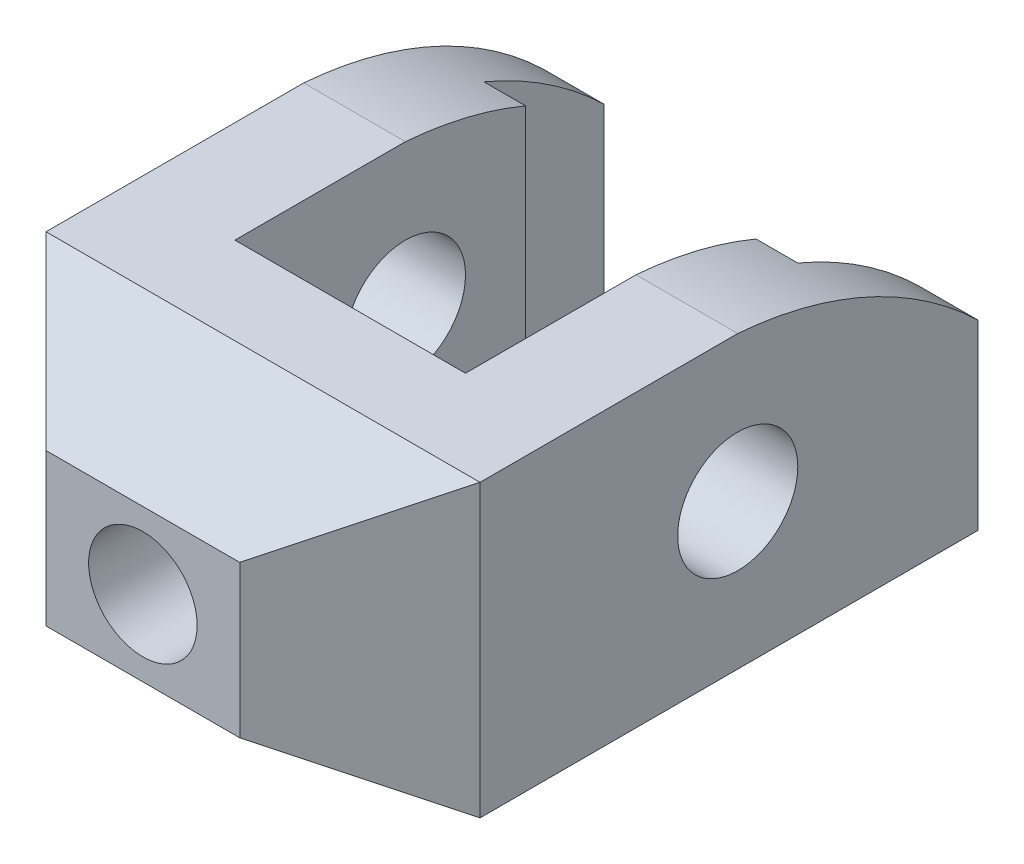
ISO-10303-21;
HEADER;
FILE_DESCRIPTION(('STEP AP214'),'2;1');
FILE_NAME('part.step','',(''),(''),'','','');
FILE_SCHEMA(('AUTOMOTIVE_DESIGN { 1 0 10303 214 1 1 1 1 }'));
ENDSEC;
DATA;
#1=APPLICATION_CONTEXT('core data for automotive mechanical design processes');
#2=APPLICATION_PROTOCOL_DEFINITION('international standard','automotive_design',2000,#1);
#3=PRODUCT_CONTEXT('',#1,'mechanical');
#4=PRODUCT('Part','Part','',(#3));
#5=PRODUCT_RELATED_PRODUCT_CATEGORY('part','',(#4));
#6=PRODUCT_DEFINITION_FORMATION('','',#4);
#7=PRODUCT_DEFINITION_CONTEXT('part definition',#1,'design');
#8=PRODUCT_DEFINITION('design','',#6,#7);
#9=PRODUCT_DEFINITION_SHAPE('','',#8);
#10=(LENGTH_UNIT() NAMED_UNIT(*) SI_UNIT(.MILLI.,.METRE.));
#11=(NAMED_UNIT(*) PLANE_ANGLE_UNIT() SI_UNIT($,.RADIAN.));
#12=(NAMED_UNIT(*) SI_UNIT($,.STERADIAN.) SOLID_ANGLE_UNIT());
#13=UNCERTAINTY_MEASURE_WITH_UNIT(LENGTH_MEASURE(1.E-05),#10,'distance_accuracy_value','');
#14=(GEOMETRIC_REPRESENTATION_CONTEXT(3) GLOBAL_UNCERTAINTY_ASSIGNED_CONTEXT((#13)) GLOBAL_UNIT_ASSIGNED_CONTEXT((#10,
#11,#12)) REPRESENTATION_CONTEXT('',''));
#15=CARTESIAN_POINT('',(0.,0.,0.));
#16=DIRECTION('',(0.,0.,1.));
#17=DIRECTION('',(1.,0.,0.));
#18=AXIS2_PLACEMENT_3D('',#15,#16,#17);
#19=CARTESIAN_POINT('',(0.,150.,0.));
#20=DIRECTION('',(0.,1.,0.));
#21=DIRECTION('',(0.,0.,1.));
#22=AXIS2_PLACEMENT_3D('',#19,#20,#21);
#23=PLANE('',#22);
#24=DIRECTION('',(0.,0.,-1.));
#25=VECTOR('',#24,1.);
#26=CARTESIAN_POINT('',(112.,150.,45.));
#27=LINE('',#26,#25);
#28=CARTESIAN_POINT('',(112.,150.,45.));
#29=VERTEX_POINT('',#28);
#30=CARTESIAN_POINT('',(112.,150.,-88.0000000000001));
#31=VERTEX_POINT('',#30);
#32=EDGE_CURVE('E178',#29,#31,#27,.T.);
#33=ORIENTED_EDGE('',*,*,#32,.T.);
#34=DIRECTION('',(-1.,0.,0.));
#35=VECTOR('',#34,1.);
#36=CARTESIAN_POINT('',(112.,150.,-88.0000000000001));
#37=LINE('',#36,#35);
#38=CARTESIAN_POINT('',(59.4999999999999,150.,-88.0000000000001));
#39=VERTEX_POINT('',#38);
#40=EDGE_CURVE('E171',#31,#39,#37,.T.);
#41=ORIENTED_EDGE('',*,*,#40,.T.);
#42=DIRECTION('',(0.,0.,1.));
#43=VECTOR('',#42,1.);
#44=CARTESIAN_POINT('',(59.5,150.,-150.));
#45=LINE('',#44,#43);
#46=CARTESIAN_POINT('',(59.5,150.,0.));
#47=VERTEX_POINT('',#46);
#48=EDGE_CURVE('E183',#39,#47,#45,.T.);
#49=ORIENTED_EDGE('',*,*,#48,.T.);
#50=DIRECTION('',(-1.,0.,0.));
#51=VECTOR('',#50,1.);
#52=CARTESIAN_POINT('',(59.5,150.,0.));
#53=LINE('',#52,#51);
#54=CARTESIAN_POINT('',(-59.5,150.,0.));
#55=VERTEX_POINT('',#54);
#56=EDGE_CURVE('E194',#47,#55,#53,.T.);
#57=ORIENTED_EDGE('',*,*,#56,.T.);
#58=DIRECTION('',(0.,0.,-1.));
#59=VECTOR('',#58,1.);
#60=CARTESIAN_POINT('',(-59.5,150.,0.));
#61=LINE('',#60,#59);
#62=CARTESIAN_POINT('',(-59.4999999999999,150.,-88.0000000000001));
#63=VERTEX_POINT('',#62);
#64=EDGE_CURVE('E169',#55,#63,#61,.T.);
#65=ORIENTED_EDGE('',*,*,#64,.T.);
#66=CARTESIAN_POINT('',(-112.,150.,-88.0000000000001));
#67=VERTEX_POINT('',#66);
#68=EDGE_CURVE('E153',#63,#67,#37,.T.);
#69=ORIENTED_EDGE('',*,*,#68,.T.);
#70=DIRECTION('',(0.,0.,1.));
#71=VECTOR('',#70,1.);
#72=CARTESIAN_POINT('',(-112.,150.,-212.));
#73=LINE('',#72,#71);
#74=CARTESIAN_POINT('',(-112.,150.,45.));
#75=VERTEX_POINT('',#74);
#76=EDGE_CURVE('E166',#67,#75,#73,.T.);
#77=ORIENTED_EDGE('',*,*,#76,.T.);
#78=DIRECTION('',(-1.,0.,0.));
#79=VECTOR('',#78,1.);
#80=CARTESIAN_POINT('',(112.,150.,45.));
#81=LINE('',#80,#79);
#82=EDGE_CURVE('E298',#29,#75,#81,.T.);
#83=ORIENTED_EDGE('',*,*,#82,.F.);
#84=EDGE_LOOP('',(#33,#41,#49,#57,#65,#69,#77,#83));
#85=FACE_BOUND('',#84,.T.);
#86=ADVANCED_FACE('F38',(#85),#23,.T.);
#87=CARTESIAN_POINT('',(-112.,150.,-212.));
#88=DIRECTION('',(1.,0.,0.));
#89=DIRECTION('',(0.,0.,-1.));
#90=AXIS2_PLACEMENT_3D('',#87,#88,#89);
#91=PLANE('',#90);
#92=CARTESIAN_POINT('',(-112.,75.,-88.));
#93=DIRECTION('',(1.,0.,0.));
#94=DIRECTION('',(0.,0.,-1.));
#95=AXIS2_PLACEMENT_3D('',#92,#93,#94);
#96=CIRCLE('',#95,31.);
#97=CARTESIAN_POINT('',(-112.,75.,-119.));
#98=VERTEX_POINT('',#97);
#99=EDGE_CURVE('E362',#98,#98,#96,.T.);
#100=ORIENTED_EDGE('',*,*,#99,.T.);
#101=EDGE_LOOP('',(#100));
#102=FACE_BOUND('',#101,.T.);
#103=CARTESIAN_POINT('',(-112.,-49.4055273230374,-72.5910521766928));
#104=DIRECTION('',(-1.,0.,0.));
#105=DIRECTION('',(0.,0.,-1.));
#106=AXIS2_PLACEMENT_3D('',#103,#104,#105);
#107=CIRCLE('',#106,200.);
#108=CARTESIAN_POINT('',(-112.,94.,-212.));
#109=VERTEX_POINT('',#108);
#110=EDGE_CURVE('E150',#67,#109,#107,.T.);
#111=ORIENTED_EDGE('',*,*,#110,.T.);
#112=DIRECTION('',(0.,-1.,0.));
#113=VECTOR('',#112,1.);
#114=CARTESIAN_POINT('',(-112.,150.,-212.));
#115=LINE('',#114,#113);
#116=CARTESIAN_POINT('',(-112.,0.,-212.));
#117=VERTEX_POINT('',#116);
#118=EDGE_CURVE('E199',#109,#117,#115,.T.);
#119=ORIENTED_EDGE('',*,*,#118,.T.);
#120=DIRECTION('',(0.,0.,1.));
#121=VECTOR('',#120,1.);
#122=CARTESIAN_POINT('',(-112.,0.,-212.));
#123=LINE('',#122,#121);
#124=CARTESIAN_POINT('',(-112.,0.,45.0000000000001));
#125=VERTEX_POINT('',#124);
#126=EDGE_CURVE('E200',#117,#125,#123,.T.);
#127=ORIENTED_EDGE('',*,*,#126,.T.);
#128=DIRECTION('',(0.,-1.,0.));
#129=VECTOR('',#128,1.);
#130=CARTESIAN_POINT('',(-112.,150.,45.0000000000001));
#131=LINE('',#130,#129);
#132=EDGE_CURVE('E48',#75,#125,#131,.T.);
#133=ORIENTED_EDGE('',*,*,#132,.F.);
#134=ORIENTED_EDGE('',*,*,#76,.F.);
#135=EDGE_LOOP('',(#111,#119,#127,#133,#134));
#136=FACE_BOUND('',#135,.T.);
#137=ADVANCED_FACE('F40',(#102,#136),#91,.F.);
#138=CARTESIAN_POINT('',(112.,150.,45.));
#139=DIRECTION('',(-1.,0.,0.));
#140=DIRECTION('',(0.,0.,1.));
#141=AXIS2_PLACEMENT_3D('',#138,#139,#140);
#142=PLANE('',#141);
#143=CARTESIAN_POINT('',(112.,75.,-88.));
#144=DIRECTION('',(1.,0.,0.));
#145=DIRECTION('',(0.,0.,-1.));
#146=AXIS2_PLACEMENT_3D('',#143,#144,#145);
#147=CIRCLE('',#146,31.);
#148=CARTESIAN_POINT('',(112.,75.,-119.));
#149=VERTEX_POINT('',#148);
#150=EDGE_CURVE('E358',#149,#149,#147,.T.);
#151=ORIENTED_EDGE('',*,*,#150,.F.);
#152=EDGE_LOOP('',(#151));
#153=FACE_BOUND('',#152,.T.);
#154=CARTESIAN_POINT('',(112.,-49.4055273230374,-72.5910521766928));
#155=DIRECTION('',(-1.,0.,0.));
#156=DIRECTION('',(0.,0.,-1.));
#157=AXIS2_PLACEMENT_3D('',#154,#155,#156);
#158=CIRCLE('',#157,200.);
#159=CARTESIAN_POINT('',(112.,94.,-212.));
#160=VERTEX_POINT('',#159);
#161=EDGE_CURVE('E159',#31,#160,#158,.T.);
#162=ORIENTED_EDGE('',*,*,#161,.F.);
#163=ORIENTED_EDGE('',*,*,#32,.F.);
#164=DIRECTION('',(0.,-1.,0.));
#165=VECTOR('',#164,1.);
#166=CARTESIAN_POINT('',(112.,150.,45.));
#167=LINE('',#166,#165);
#168=CARTESIAN_POINT('',(112.,0.,45.));
#169=VERTEX_POINT('',#168);
#170=EDGE_CURVE('E267',#29,#169,#167,.T.);
#171=ORIENTED_EDGE('',*,*,#170,.T.);
#172=DIRECTION('',(0.,0.,-1.));
#173=VECTOR('',#172,1.);
#174=CARTESIAN_POINT('',(112.,0.,45.));
#175=LINE('',#174,#173);
#176=CARTESIAN_POINT('',(112.,0.,-212.));
#177=VERTEX_POINT('',#176);
#178=EDGE_CURVE('E203',#169,#177,#175,.T.);
#179=ORIENTED_EDGE('',*,*,#178,.T.);
#180=DIRECTION('',(0.,-1.,0.));
#181=VECTOR('',#180,1.);
#182=CARTESIAN_POINT('',(112.,150.,-212.));
#183=LINE('',#182,#181);
#184=EDGE_CURVE('E264',#160,#177,#183,.T.);
#185=ORIENTED_EDGE('',*,*,#184,.F.);
#186=EDGE_LOOP('',(#162,#163,#171,#179,#185));
#187=FACE_BOUND('',#186,.T.);
#188=ADVANCED_FACE('F395',(#153,#187),#142,.F.);
#189=CARTESIAN_POINT('',(112.,150.,-212.));
#190=DIRECTION('',(0.,0.,1.));
#191=DIRECTION('',(1.,0.,0.));
#192=AXIS2_PLACEMENT_3D('',#189,#190,#191);
#193=PLANE('',#192);
#194=DIRECTION('',(-1.,0.,0.));
#195=VECTOR('',#194,1.);
#196=CARTESIAN_POINT('',(112.,94.,-212.));
#197=LINE('',#196,#195);
#198=CARTESIAN_POINT('',(80.9999999999999,94.,-212.));
#199=VERTEX_POINT('',#198);
#200=EDGE_CURVE('E172',#160,#199,#197,.T.);
#201=ORIENTED_EDGE('',*,*,#200,.F.);
#202=ORIENTED_EDGE('',*,*,#184,.T.);
#203=DIRECTION('',(-1.,0.,0.));
#204=VECTOR('',#203,1.);
#205=CARTESIAN_POINT('',(112.,0.,-212.));
#206=LINE('',#205,#204);
#207=CARTESIAN_POINT('',(80.9999999999999,0.,-212.));
#208=VERTEX_POINT('',#207);
#209=EDGE_CURVE('E207',#177,#208,#206,.T.);
#210=ORIENTED_EDGE('',*,*,#209,.T.);
#211=DIRECTION('',(0.,-1.,0.));
#212=VECTOR('',#211,1.);
#213=CARTESIAN_POINT('',(80.9999999999999,150.,-212.));
#214=LINE('',#213,#212);
#215=EDGE_CURVE('E261',#199,#208,#214,.T.);
#216=ORIENTED_EDGE('',*,*,#215,.F.);
#217=EDGE_LOOP('',(#201,#202,#210,#216));
#218=FACE_BOUND('',#217,.T.);
#219=ADVANCED_FACE('F432',(#218),#193,.F.);
#220=CARTESIAN_POINT('',(80.9999999999999,150.,-212.));
#221=DIRECTION('',(1.,0.,0.));
#222=DIRECTION('',(0.,0.,-1.));
#223=AXIS2_PLACEMENT_3D('',#220,#221,#222);
#224=PLANE('',#223);
#225=CARTESIAN_POINT('',(81.,-49.4055273230374,-72.5910521766928));
#226=DIRECTION('',(1.,0.,0.));
#227=DIRECTION('',(0.,0.,-1.));
#228=AXIS2_PLACEMENT_3D('',#225,#226,#227);
#229=CIRCLE('',#228,200.);
#230=CARTESIAN_POINT('',(81.,135.006659901366,-150.));
#231=VERTEX_POINT('',#230);
#232=EDGE_CURVE('E305',#199,#231,#229,.T.);
#233=ORIENTED_EDGE('',*,*,#232,.F.);
#234=ORIENTED_EDGE('',*,*,#215,.T.);
#235=DIRECTION('',(0.,0.,1.));
#236=VECTOR('',#235,1.);
#237=CARTESIAN_POINT('',(80.9999999999999,0.,-212.));
#238=LINE('',#237,#236);
#239=CARTESIAN_POINT('',(81.,0.,-150.));
#240=VERTEX_POINT('',#239);
#241=EDGE_CURVE('E211',#208,#240,#238,.T.);
#242=ORIENTED_EDGE('',*,*,#241,.T.);
#243=DIRECTION('',(0.,-1.,0.));
#244=VECTOR('',#243,1.);
#245=CARTESIAN_POINT('',(81.,150.,-150.));
#246=LINE('',#245,#244);
#247=EDGE_CURVE('E258',#231,#240,#246,.T.);
#248=ORIENTED_EDGE('',*,*,#247,.F.);
#249=EDGE_LOOP('',(#233,#234,#242,#248));
#250=FACE_BOUND('',#249,.T.);
#251=ADVANCED_FACE('F428',(#250),#224,.F.);
#252=CARTESIAN_POINT('',(81.,150.,-150.));
#253=DIRECTION('',(0.,0.,1.));
#254=DIRECTION('',(1.,0.,0.));
#255=AXIS2_PLACEMENT_3D('',#252,#253,#254);
#256=PLANE('',#255);
#257=DIRECTION('',(-1.,0.,0.));
#258=VECTOR('',#257,1.);
#259=CARTESIAN_POINT('',(112.,135.006659901366,-150.));
#260=LINE('',#259,#258);
#261=CARTESIAN_POINT('',(59.5,135.006659901366,-150.));
#262=VERTEX_POINT('',#261);
#263=EDGE_CURVE('E55',#231,#262,#260,.T.);
#264=ORIENTED_EDGE('',*,*,#263,.F.);
#265=ORIENTED_EDGE('',*,*,#247,.T.);
#266=DIRECTION('',(-1.,0.,0.));
#267=VECTOR('',#266,1.);
#268=CARTESIAN_POINT('',(81.,0.,-150.));
#269=LINE('',#268,#267);
#270=CARTESIAN_POINT('',(59.5,0.,-150.));
#271=VERTEX_POINT('',#270);
#272=EDGE_CURVE('E215',#240,#271,#269,.T.);
#273=ORIENTED_EDGE('',*,*,#272,.T.);
#274=DIRECTION('',(0.,-1.,0.));
#275=VECTOR('',#274,1.);
#276=CARTESIAN_POINT('',(59.5,150.,-150.));
#277=LINE('',#276,#275);
#278=EDGE_CURVE('E255',#262,#271,#277,.T.);
#279=ORIENTED_EDGE('',*,*,#278,.F.);
#280=EDGE_LOOP('',(#264,#265,#273,#279));
#281=FACE_BOUND('',#280,.T.);
#282=ADVANCED_FACE('F424',(#281),#256,.F.);
#283=CARTESIAN_POINT('',(59.5,150.,-150.));
#284=DIRECTION('',(1.,0.,0.));
#285=DIRECTION('',(0.,0.,-1.));
#286=AXIS2_PLACEMENT_3D('',#283,#284,#285);
#287=PLANE('',#286);
#288=CARTESIAN_POINT('',(59.4999999999999,75.,-88.));
#289=DIRECTION('',(1.,0.,0.));
#290=DIRECTION('',(0.,0.,-1.));
#291=AXIS2_PLACEMENT_3D('',#288,#289,#290);
#292=CIRCLE('',#291,31.);
#293=CARTESIAN_POINT('',(59.4999999999999,75.,-119.));
#294=VERTEX_POINT('',#293);
#295=EDGE_CURVE('E351',#294,#294,#292,.T.);
#296=ORIENTED_EDGE('',*,*,#295,.T.);
#297=EDGE_LOOP('',(#296));
#298=FACE_BOUND('',#297,.T.);
#299=CARTESIAN_POINT('',(59.5,-49.4055273230374,-72.5910521766928));
#300=DIRECTION('',(1.,0.,0.));
#301=DIRECTION('',(0.,0.,-1.));
#302=AXIS2_PLACEMENT_3D('',#299,#300,#301);
#303=CIRCLE('',#302,200.);
#304=EDGE_CURVE('E330',#262,#39,#303,.T.);
#305=ORIENTED_EDGE('',*,*,#304,.F.);
#306=ORIENTED_EDGE('',*,*,#278,.T.);
#307=DIRECTION('',(0.,0.,1.));
#308=VECTOR('',#307,1.);
#309=CARTESIAN_POINT('',(59.5,0.,-150.));
#310=LINE('',#309,#308);
#311=CARTESIAN_POINT('',(59.5,0.,0.));
#312=VERTEX_POINT('',#311);
#313=EDGE_CURVE('E219',#271,#312,#310,.T.);
#314=ORIENTED_EDGE('',*,*,#313,.T.);
#315=DIRECTION('',(0.,-1.,0.));
#316=VECTOR('',#315,1.);
#317=CARTESIAN_POINT('',(59.5,150.,0.));
#318=LINE('',#317,#316);
#319=EDGE_CURVE('E251',#47,#312,#318,.T.);
#320=ORIENTED_EDGE('',*,*,#319,.F.);
#321=ORIENTED_EDGE('',*,*,#48,.F.);
#322=EDGE_LOOP('',(#305,#306,#314,#320,#321));
#323=FACE_BOUND('',#322,.T.);
#324=ADVANCED_FACE('F418',(#298,#323),#287,.F.);
#325=CARTESIAN_POINT('',(-59.5,150.,0.));
#326=DIRECTION('',(-1.,0.,0.));
#327=DIRECTION('',(0.,0.,1.));
#328=AXIS2_PLACEMENT_3D('',#325,#326,#327);
#329=PLANE('',#328);
#330=CARTESIAN_POINT('',(-59.5,75.,-88.));
#331=DIRECTION('',(-1.,0.,0.));
#332=DIRECTION('',(0.,0.,1.));
#333=AXIS2_PLACEMENT_3D('',#330,#331,#332);
#334=CIRCLE('',#333,31.);
#335=CARTESIAN_POINT('',(-59.5,75.,-57.));
#336=VERTEX_POINT('',#335);
#337=EDGE_CURVE('E42',#336,#336,#334,.T.);
#338=ORIENTED_EDGE('',*,*,#337,.T.);
#339=EDGE_LOOP('',(#338));
#340=FACE_BOUND('',#339,.T.);
#341=CARTESIAN_POINT('',(-59.5,-49.4055273230374,-72.5910521766928));
#342=DIRECTION('',(-1.,0.,0.));
#343=DIRECTION('',(0.,0.,1.));
#344=AXIS2_PLACEMENT_3D('',#341,#342,#343);
#345=CIRCLE('',#344,200.);
#346=CARTESIAN_POINT('',(-59.5,135.006659901366,-150.));
#347=VERTEX_POINT('',#346);
#348=EDGE_CURVE('E333',#63,#347,#345,.T.);
#349=ORIENTED_EDGE('',*,*,#348,.F.);
#350=ORIENTED_EDGE('',*,*,#64,.F.);
#351=DIRECTION('',(0.,-1.,0.));
#352=VECTOR('',#351,1.);
#353=CARTESIAN_POINT('',(-59.5,150.,0.));
#354=LINE('',#353,#352);
#355=CARTESIAN_POINT('',(-59.5,0.,0.));
#356=VERTEX_POINT('',#355);
#357=EDGE_CURVE('E247',#55,#356,#354,.T.);
#358=ORIENTED_EDGE('',*,*,#357,.T.);
#359=DIRECTION('',(0.,0.,-1.));
#360=VECTOR('',#359,1.);
#361=CARTESIAN_POINT('',(-59.5,0.,0.));
#362=LINE('',#361,#360);
#363=CARTESIAN_POINT('',(-59.5,0.,-150.));
#364=VERTEX_POINT('',#363);
#365=EDGE_CURVE('E225',#356,#364,#362,.T.);
#366=ORIENTED_EDGE('',*,*,#365,.T.);
#367=DIRECTION('',(0.,-1.,0.));
#368=VECTOR('',#367,1.);
#369=CARTESIAN_POINT('',(-59.5,150.,-150.));
#370=LINE('',#369,#368);
#371=EDGE_CURVE('E244',#347,#364,#370,.T.);
#372=ORIENTED_EDGE('',*,*,#371,.F.);
#373=EDGE_LOOP('',(#349,#350,#358,#366,#372));
#374=FACE_BOUND('',#373,.T.);
#375=ADVANCED_FACE('F371',(#340,#374),#329,.F.);
#376=CARTESIAN_POINT('',(-59.5,150.,-150.));
#377=DIRECTION('',(0.,0.,1.));
#378=DIRECTION('',(1.,0.,0.));
#379=AXIS2_PLACEMENT_3D('',#376,#377,#378);
#380=PLANE('',#379);
#381=DIRECTION('',(-1.,0.,0.));
#382=VECTOR('',#381,1.);
#383=CARTESIAN_POINT('',(112.,135.006659901366,-150.));
#384=LINE('',#383,#382);
#385=CARTESIAN_POINT('',(-81.0000000000001,135.006659901366,-150.));
#386=VERTEX_POINT('',#385);
#387=EDGE_CURVE('E336',#347,#386,#384,.T.);
#388=ORIENTED_EDGE('',*,*,#387,.F.);
#389=ORIENTED_EDGE('',*,*,#371,.T.);
#390=DIRECTION('',(-1.,0.,0.));
#391=VECTOR('',#390,1.);
#392=CARTESIAN_POINT('',(-59.5,0.,-150.));
#393=LINE('',#392,#391);
#394=CARTESIAN_POINT('',(-81.,0.,-150.));
#395=VERTEX_POINT('',#394);
#396=EDGE_CURVE('E229',#364,#395,#393,.T.);
#397=ORIENTED_EDGE('',*,*,#396,.T.);
#398=DIRECTION('',(0.,-1.,0.));
#399=VECTOR('',#398,1.);
#400=CARTESIAN_POINT('',(-81.,150.,-150.));
#401=LINE('',#400,#399);
#402=EDGE_CURVE('E241',#386,#395,#401,.T.);
#403=ORIENTED_EDGE('',*,*,#402,.F.);
#404=EDGE_LOOP('',(#388,#389,#397,#403));
#405=FACE_BOUND('',#404,.T.);
#406=ADVANCED_FACE('F411',(#405),#380,.F.);
#407=CARTESIAN_POINT('',(-81.,150.,-150.));
#408=DIRECTION('',(-1.,0.,0.));
#409=DIRECTION('',(0.,0.,1.));
#410=AXIS2_PLACEMENT_3D('',#407,#408,#409);
#411=PLANE('',#410);
#412=CARTESIAN_POINT('',(-81.,-49.4055273230374,-72.5910521766928));
#413=DIRECTION('',(-1.,0.,0.));
#414=DIRECTION('',(0.,0.,1.));
#415=AXIS2_PLACEMENT_3D('',#412,#413,#414);
#416=CIRCLE('',#415,200.);
#417=CARTESIAN_POINT('',(-81.0000000000001,94.0000000000001,-212.));
#418=VERTEX_POINT('',#417);
#419=EDGE_CURVE('E62',#386,#418,#416,.T.);
#420=ORIENTED_EDGE('',*,*,#419,.F.);
#421=ORIENTED_EDGE('',*,*,#402,.T.);
#422=DIRECTION('',(0.,0.,-1.));
#423=VECTOR('',#422,1.);
#424=CARTESIAN_POINT('',(-81.,0.,-150.));
#425=LINE('',#424,#423);
#426=CARTESIAN_POINT('',(-81.0000000000001,0.,-212.));
#427=VERTEX_POINT('',#426);
#428=EDGE_CURVE('E186',#395,#427,#425,.T.);
#429=ORIENTED_EDGE('',*,*,#428,.T.);
#430=DIRECTION('',(0.,-1.,0.));
#431=VECTOR('',#430,1.);
#432=CARTESIAN_POINT('',(-81.0000000000001,150.,-212.));
#433=LINE('',#432,#431);
#434=EDGE_CURVE('E238',#418,#427,#433,.T.);
#435=ORIENTED_EDGE('',*,*,#434,.F.);
#436=EDGE_LOOP('',(#420,#421,#429,#435));
#437=FACE_BOUND('',#436,.T.);
#438=ADVANCED_FACE('F407',(#437),#411,.F.);
#439=CARTESIAN_POINT('',(-81.0000000000001,150.,-212.));
#440=DIRECTION('',(0.,0.,1.));
#441=DIRECTION('',(1.,0.,0.));
#442=AXIS2_PLACEMENT_3D('',#439,#440,#441);
#443=PLANE('',#442);
#444=DIRECTION('',(-1.,0.,0.));
#445=VECTOR('',#444,1.);
#446=CARTESIAN_POINT('',(112.,94.0000000000001,-212.));
#447=LINE('',#446,#445);
#448=EDGE_CURVE('E11',#418,#109,#447,.T.);
#449=ORIENTED_EDGE('',*,*,#448,.F.);
#450=ORIENTED_EDGE('',*,*,#434,.T.);
#451=DIRECTION('',(-1.,0.,0.));
#452=VECTOR('',#451,1.);
#453=CARTESIAN_POINT('',(-81.0000000000001,0.,-212.));
#454=LINE('',#453,#452);
#455=EDGE_CURVE('E179',#427,#117,#454,.T.);
#456=ORIENTED_EDGE('',*,*,#455,.T.);
#457=ORIENTED_EDGE('',*,*,#118,.F.);
#458=EDGE_LOOP('',(#449,#450,#456,#457));
#459=FACE_BOUND('',#458,.T.);
#460=ADVANCED_FACE('F404',(#459),#443,.F.);
#461=CARTESIAN_POINT('',(-112.,150.,45.0000000000001));
#462=DIRECTION('',(0.707106781186546,0.,-0.707106781186549));
#463=DIRECTION('',(-0.707106781186549,0.,-0.707106781186546));
#464=AXIS2_PLACEMENT_3D('',#461,#462,#463);
#465=PLANE('',#464);
#466=DIRECTION('',(0.65465367070798,-0.377964473009222,0.654653670707977));
#467=VECTOR('',#466,1.);
#468=CARTESIAN_POINT('',(-112.,150.,45.0000000000001));
#469=LINE('',#468,#467);
#470=CARTESIAN_POINT('',(-49.9999999999997,114.204283310244,107.));
#471=VERTEX_POINT('',#470);
#472=EDGE_CURVE('E189',#75,#471,#469,.T.);
#473=ORIENTED_EDGE('',*,*,#472,.F.);
#474=ORIENTED_EDGE('',*,*,#132,.T.);
#475=DIRECTION('',(-0.65465367070798,-0.377964473009222,-0.654653670707977));
#476=VECTOR('',#475,1.);
#477=CARTESIAN_POINT('',(-74.8846255520958,21.4285714285709,82.1153744479041));
#478=LINE('',#477,#476);
#479=CARTESIAN_POINT('',(-49.9999999999997,35.7957166897563,107.));
#480=VERTEX_POINT('',#479);
#481=EDGE_CURVE('E285',#480,#125,#478,.T.);
#482=ORIENTED_EDGE('',*,*,#481,.F.);
#483=DIRECTION('',(0.,-1.,0.));
#484=VECTOR('',#483,1.);
#485=CARTESIAN_POINT('',(-49.9999999999997,150.,107.));
#486=LINE('',#485,#484);
#487=EDGE_CURVE('E275',#471,#480,#486,.T.);
#488=ORIENTED_EDGE('',*,*,#487,.F.);
#489=EDGE_LOOP('',(#473,#474,#482,#488));
#490=FACE_BOUND('',#489,.T.);
#491=ADVANCED_FACE('F283',(#490),#465,.F.);
#492=CARTESIAN_POINT('',(-49.9999999999997,150.,107.));
#493=DIRECTION('',(0.,0.,-1.));
#494=DIRECTION('',(-1.,0.,0.));
#495=AXIS2_PLACEMENT_3D('',#492,#493,#494);
#496=PLANE('',#495);
#497=CARTESIAN_POINT('',(0.,75.,107.));
#498=DIRECTION('',(0.,0.,1.));
#499=DIRECTION('',(1.,0.,0.));
#500=AXIS2_PLACEMENT_3D('',#497,#498,#499);
#501=CIRCLE('',#500,28.);
#502=CARTESIAN_POINT('',(28.,75.,107.));
#503=VERTEX_POINT('',#502);
#504=EDGE_CURVE('E347',#503,#503,#501,.T.);
#505=ORIENTED_EDGE('',*,*,#504,.F.);
#506=EDGE_LOOP('',(#505));
#507=FACE_BOUND('',#506,.T.);
#508=DIRECTION('',(-1.,0.,0.));
#509=VECTOR('',#508,1.);
#510=CARTESIAN_POINT('',(112.,114.204283310244,107.));
#511=LINE('',#510,#509);
#512=CARTESIAN_POINT('',(49.9999999999998,114.204283310244,107.));
#513=VERTEX_POINT('',#512);
#514=EDGE_CURVE('E303',#513,#471,#511,.T.);
#515=ORIENTED_EDGE('',*,*,#514,.T.);
#516=ORIENTED_EDGE('',*,*,#487,.T.);
#517=DIRECTION('',(-1.,0.,0.));
#518=VECTOR('',#517,1.);
#519=CARTESIAN_POINT('',(112.,35.7957166897563,107.));
#520=LINE('',#519,#518);
#521=CARTESIAN_POINT('',(49.9999999999998,35.7957166897563,107.));
#522=VERTEX_POINT('',#521);
#523=EDGE_CURVE('E299',#522,#480,#520,.T.);
#524=ORIENTED_EDGE('',*,*,#523,.F.);
#525=DIRECTION('',(0.,-1.,0.));
#526=VECTOR('',#525,1.);
#527=CARTESIAN_POINT('',(49.9999999999998,150.,107.));
#528=LINE('',#527,#526);
#529=EDGE_CURVE('E271',#513,#522,#528,.T.);
#530=ORIENTED_EDGE('',*,*,#529,.F.);
#531=EDGE_LOOP('',(#515,#516,#524,#530));
#532=FACE_BOUND('',#531,.T.);
#533=ADVANCED_FACE('F322',(#507,#532),#496,.F.);
#534=CARTESIAN_POINT('',(49.9999999999998,150.,107.));
#535=DIRECTION('',(-0.707106781186546,0.,-0.707106781186549));
#536=DIRECTION('',(-0.707106781186549,0.,0.707106781186546));
#537=AXIS2_PLACEMENT_3D('',#534,#535,#536);
#538=PLANE('',#537);
#539=DIRECTION('',(0.65465367070798,0.377964473009222,-0.654653670707978));
#540=VECTOR('',#539,1.);
#541=CARTESIAN_POINT('',(58.8571428571424,119.317957123066,98.1428571428574));
#542=LINE('',#541,#540);
#543=EDGE_CURVE('E313',#513,#29,#542,.T.);
#544=ORIENTED_EDGE('',*,*,#543,.F.);
#545=ORIENTED_EDGE('',*,*,#529,.T.);
#546=DIRECTION('',(-0.65465367070798,0.377964473009222,0.654653670707978));
#547=VECTOR('',#546,1.);
#548=CARTESIAN_POINT('',(21.7417684092383,52.110614305505,135.258231590761));
#549=LINE('',#548,#547);
#550=EDGE_CURVE('E309',#169,#522,#549,.T.);
#551=ORIENTED_EDGE('',*,*,#550,.F.);
#552=ORIENTED_EDGE('',*,*,#170,.F.);
#553=EDGE_LOOP('',(#544,#545,#551,#552));
#554=FACE_BOUND('',#553,.T.);
#555=ADVANCED_FACE('F403',(#554),#538,.F.);
#556=CARTESIAN_POINT('',(0.,0.,0.));
#557=DIRECTION('',(0.,1.,0.));
#558=DIRECTION('',(0.,0.,1.));
#559=AXIS2_PLACEMENT_3D('',#556,#557,#558);
#560=PLANE('',#559);
#561=DIRECTION('',(-1.,0.,0.));
#562=VECTOR('',#561,1.);
#563=CARTESIAN_POINT('',(112.,0.,45.));
#564=LINE('',#563,#562);
#565=EDGE_CURVE('E293',#169,#125,#564,.T.);
#566=ORIENTED_EDGE('',*,*,#565,.T.);
#567=ORIENTED_EDGE('',*,*,#126,.F.);
#568=ORIENTED_EDGE('',*,*,#455,.F.);
#569=ORIENTED_EDGE('',*,*,#428,.F.);
#570=ORIENTED_EDGE('',*,*,#396,.F.);
#571=ORIENTED_EDGE('',*,*,#365,.F.);
#572=DIRECTION('',(-1.,0.,0.));
#573=VECTOR('',#572,1.);
#574=CARTESIAN_POINT('',(59.5,0.,0.));
#575=LINE('',#574,#573);
#576=EDGE_CURVE('E222',#312,#356,#575,.T.);
#577=ORIENTED_EDGE('',*,*,#576,.F.);
#578=ORIENTED_EDGE('',*,*,#313,.F.);
#579=ORIENTED_EDGE('',*,*,#272,.F.);
#580=ORIENTED_EDGE('',*,*,#241,.F.);
#581=ORIENTED_EDGE('',*,*,#209,.F.);
#582=ORIENTED_EDGE('',*,*,#178,.F.);
#583=EDGE_LOOP('',(#566,#567,#568,#569,#570,#571,#577,#578,#579,#580,#581,#582));
#584=FACE_BOUND('',#583,.T.);
#585=ADVANCED_FACE('F290',(#584),#560,.F.);
#586=CARTESIAN_POINT('',(59.5,150.,0.));
#587=DIRECTION('',(0.,0.,1.));
#588=DIRECTION('',(1.,0.,0.));
#589=AXIS2_PLACEMENT_3D('',#586,#587,#588);
#590=PLANE('',#589);
#591=ORIENTED_EDGE('',*,*,#576,.T.);
#592=ORIENTED_EDGE('',*,*,#357,.F.);
#593=ORIENTED_EDGE('',*,*,#56,.F.);
#594=ORIENTED_EDGE('',*,*,#319,.T.);
#595=EDGE_LOOP('',(#591,#592,#593,#594));
#596=FACE_BOUND('',#595,.T.);
#597=ADVANCED_FACE('F402',(#596),#590,.F.);
#598=CARTESIAN_POINT('',(112.,0.,45.));
#599=DIRECTION('',(0.,-0.866025403784442,0.499999999999995));
#600=DIRECTION('',(0.,-0.499999999999995,-0.866025403784442));
#601=AXIS2_PLACEMENT_3D('',#598,#599,#600);
#602=PLANE('',#601);
#603=ORIENTED_EDGE('',*,*,#481,.T.);
#604=ORIENTED_EDGE('',*,*,#565,.F.);
#605=ORIENTED_EDGE('',*,*,#550,.T.);
#606=ORIENTED_EDGE('',*,*,#523,.T.);
#607=EDGE_LOOP('',(#603,#604,#605,#606));
#608=FACE_BOUND('',#607,.T.);
#609=ADVANCED_FACE('F398',(#608),#602,.T.);
#610=CARTESIAN_POINT('',(112.,150.,45.));
#611=DIRECTION('',(0.,0.866025403784442,0.499999999999994));
#612=DIRECTION('',(0.,-0.499999999999995,0.866025403784442));
#613=AXIS2_PLACEMENT_3D('',#610,#611,#612);
#614=PLANE('',#613);
#615=ORIENTED_EDGE('',*,*,#472,.T.);
#616=ORIENTED_EDGE('',*,*,#514,.F.);
#617=ORIENTED_EDGE('',*,*,#543,.T.);
#618=ORIENTED_EDGE('',*,*,#82,.T.);
#619=EDGE_LOOP('',(#615,#616,#617,#618));
#620=FACE_BOUND('',#619,.T.);
#621=ADVANCED_FACE('F319',(#620),#614,.T.);
#622=CARTESIAN_POINT('',(112.,-49.4055273230374,-72.5910521766928));
#623=DIRECTION('',(-1.,0.,0.));
#624=DIRECTION('',(0.,0.,1.));
#625=AXIS2_PLACEMENT_3D('',#622,#623,#624);
#626=CYLINDRICAL_SURFACE('',#625,200.);
#627=ORIENTED_EDGE('',*,*,#348,.T.);
#628=ORIENTED_EDGE('',*,*,#387,.T.);
#629=ORIENTED_EDGE('',*,*,#419,.T.);
#630=ORIENTED_EDGE('',*,*,#448,.T.);
#631=ORIENTED_EDGE('',*,*,#110,.F.);
#632=ORIENTED_EDGE('',*,*,#68,.F.);
#633=EDGE_LOOP('',(#627,#628,#629,#630,#631,#632));
#634=FACE_BOUND('',#633,.T.);
#635=ADVANCED_FACE('F152',(#634),#626,.T.);
#636=ORIENTED_EDGE('',*,*,#232,.T.);
#637=ORIENTED_EDGE('',*,*,#263,.T.);
#638=ORIENTED_EDGE('',*,*,#304,.T.);
#639=ORIENTED_EDGE('',*,*,#40,.F.);
#640=ORIENTED_EDGE('',*,*,#161,.T.);
#641=ORIENTED_EDGE('',*,*,#200,.T.);
#642=EDGE_LOOP('',(#636,#637,#638,#639,#640,#641));
#643=FACE_BOUND('',#642,.T.);
#644=ADVANCED_FACE('F537',(#643),#626,.T.);
#645=CARTESIAN_POINT('',(0.,75.,57.));
#646=DIRECTION('',(0.,0.,1.));
#647=DIRECTION('',(1.,0.,0.));
#648=AXIS2_PLACEMENT_3D('',#645,#646,#647);
#649=CYLINDRICAL_SURFACE('',#648,28.);
#650=CARTESIAN_POINT('',(0.,75.,57.));
#651=DIRECTION('',(0.,0.,1.));
#652=DIRECTION('',(1.,0.,0.));
#653=AXIS2_PLACEMENT_3D('',#650,#651,#652);
#654=CIRCLE('',#653,28.);
#655=CARTESIAN_POINT('',(28.,75.,57.));
#656=VERTEX_POINT('',#655);
#657=EDGE_CURVE('E160',#656,#656,#654,.T.);
#658=ORIENTED_EDGE('',*,*,#657,.F.);
#659=EDGE_LOOP('',(#658));
#660=FACE_BOUND('',#659,.T.);
#661=ORIENTED_EDGE('',*,*,#504,.T.);
#662=EDGE_LOOP('',(#661));
#663=FACE_BOUND('',#662,.T.);
#664=ADVANCED_FACE('F385',(#660,#663),#649,.F.);
#665=CARTESIAN_POINT('',(0.,75.,57.));
#666=DIRECTION('',(0.,0.,1.));
#667=DIRECTION('',(1.,0.,0.));
#668=AXIS2_PLACEMENT_3D('',#665,#666,#667);
#669=PLANE('',#668);
#670=ORIENTED_EDGE('',*,*,#657,.T.);
#671=EDGE_LOOP('',(#670));
#672=FACE_BOUND('',#671,.T.);
#673=ADVANCED_FACE('F377',(#672),#669,.T.);
#674=CARTESIAN_POINT('',(-112.,75.,-88.));
#675=DIRECTION('',(1.,0.,0.));
#676=DIRECTION('',(0.,0.,-1.));
#677=AXIS2_PLACEMENT_3D('',#674,#675,#676);
#678=CYLINDRICAL_SURFACE('',#677,31.);
#679=ORIENTED_EDGE('',*,*,#99,.F.);
#680=EDGE_LOOP('',(#679));
#681=FACE_BOUND('',#680,.T.);
#682=ORIENTED_EDGE('',*,*,#337,.F.);
#683=EDGE_LOOP('',(#682));
#684=FACE_BOUND('',#683,.T.);
#685=ADVANCED_FACE('F374',(#681,#684),#678,.F.);
#686=ORIENTED_EDGE('',*,*,#150,.T.);
#687=EDGE_LOOP('',(#686));
#688=FACE_BOUND('',#687,.T.);
#689=ORIENTED_EDGE('',*,*,#295,.F.);
#690=EDGE_LOOP('',(#689));
#691=FACE_BOUND('',#690,.T.);
#692=ADVANCED_FACE('F376',(#688,#691),#678,.F.);
#693=CLOSED_SHELL('',(#86,#137,#188,#219,#251,#282,#324,#375,#406,#438,#460,#491,#533,#555,#585,
#597,#609,#621,#635,#644,#664,#673,#685,#692));
#694=MANIFOLD_SOLID_BREP('B2',#693);
#695=ADVANCED_BREP_SHAPE_REPRESENTATION('',(#18,#694),#14);
#696=SHAPE_DEFINITION_REPRESENTATION(#9,#695);
ENDSEC;
END-ISO-10303-21;
